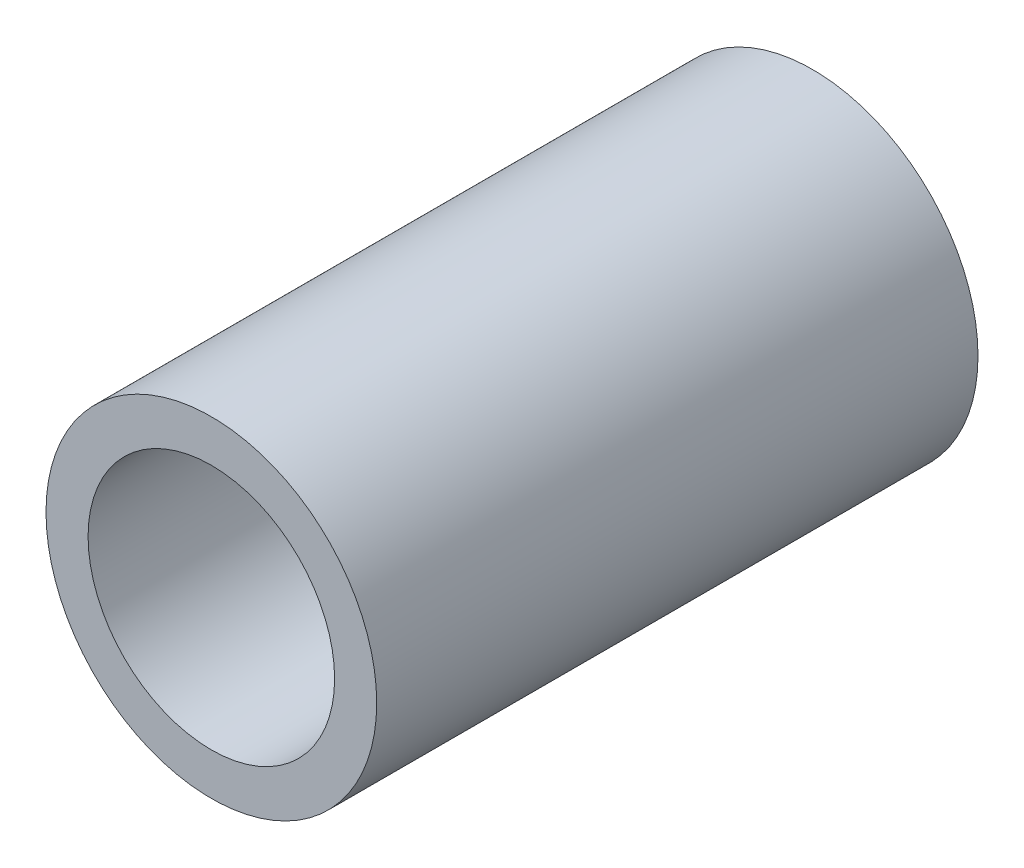
ISO-10303-21;
HEADER;
FILE_DESCRIPTION(('STEP AP214'),'2;1');
FILE_NAME('part.step','',(''),(''),'','','');
FILE_SCHEMA(('AUTOMOTIVE_DESIGN { 1 0 10303 214 1 1 1 1 }'));
ENDSEC;
DATA;
#1=APPLICATION_CONTEXT('core data for automotive mechanical design processes');
#2=APPLICATION_PROTOCOL_DEFINITION('international standard','automotive_design',2000,#1);
#3=PRODUCT_CONTEXT('',#1,'mechanical');
#4=PRODUCT('Part','Part','',(#3));
#5=PRODUCT_RELATED_PRODUCT_CATEGORY('part','',(#4));
#6=PRODUCT_DEFINITION_FORMATION('','',#4);
#7=PRODUCT_DEFINITION_CONTEXT('part definition',#1,'design');
#8=PRODUCT_DEFINITION('design','',#6,#7);
#9=PRODUCT_DEFINITION_SHAPE('','',#8);
#10=(LENGTH_UNIT() NAMED_UNIT(*) SI_UNIT(.MILLI.,.METRE.));
#11=(NAMED_UNIT(*) PLANE_ANGLE_UNIT() SI_UNIT($,.RADIAN.));
#12=(NAMED_UNIT(*) SI_UNIT($,.STERADIAN.) SOLID_ANGLE_UNIT());
#13=UNCERTAINTY_MEASURE_WITH_UNIT(LENGTH_MEASURE(1.E-05),#10,'distance_accuracy_value','');
#14=(GEOMETRIC_REPRESENTATION_CONTEXT(3) GLOBAL_UNCERTAINTY_ASSIGNED_CONTEXT((#13)) GLOBAL_UNIT_ASSIGNED_CONTEXT((#10,
#11,#12)) REPRESENTATION_CONTEXT('',''));
#15=CARTESIAN_POINT('',(0.,0.,0.));
#16=DIRECTION('',(0.,0.,1.));
#17=DIRECTION('',(1.,0.,0.));
#18=AXIS2_PLACEMENT_3D('',#15,#16,#17);
#19=CARTESIAN_POINT('',(0.,0.,15.));
#20=DIRECTION('',(0.,0.,1.));
#21=DIRECTION('',(1.,0.,0.));
#22=AXIS2_PLACEMENT_3D('',#19,#20,#21);
#23=PLANE('',#22);
#24=CARTESIAN_POINT('',(0.,0.,15.));
#25=DIRECTION('',(0.,0.,1.));
#26=DIRECTION('',(1.,0.,0.));
#27=AXIS2_PLACEMENT_3D('',#24,#25,#26);
#28=CIRCLE('',#27,4.125);
#29=CARTESIAN_POINT('',(4.125,0.,15.));
#30=VERTEX_POINT('',#29);
#31=EDGE_CURVE('E10',#30,#30,#28,.T.);
#32=ORIENTED_EDGE('',*,*,#31,.T.);
#33=EDGE_LOOP('',(#32));
#34=FACE_BOUND('',#33,.T.);
#35=CARTESIAN_POINT('',(0.,0.,15.));
#36=DIRECTION('',(0.,0.,1.));
#37=DIRECTION('',(1.,0.,0.));
#38=AXIS2_PLACEMENT_3D('',#35,#36,#37);
#39=CIRCLE('',#38,3.075);
#40=CARTESIAN_POINT('',(3.075,0.,15.));
#41=VERTEX_POINT('',#40);
#42=EDGE_CURVE('E46',#41,#41,#39,.T.);
#43=ORIENTED_EDGE('',*,*,#42,.F.);
#44=EDGE_LOOP('',(#43));
#45=FACE_BOUND('',#44,.T.);
#46=ADVANCED_FACE('F35',(#34,#45),#23,.T.);
#47=CARTESIAN_POINT('',(0.,0.,0.));
#48=DIRECTION('',(0.,0.,1.));
#49=DIRECTION('',(1.,0.,0.));
#50=AXIS2_PLACEMENT_3D('',#47,#48,#49);
#51=PLANE('',#50);
#52=CARTESIAN_POINT('',(0.,0.,0.));
#53=DIRECTION('',(0.,0.,1.));
#54=DIRECTION('',(1.,0.,0.));
#55=AXIS2_PLACEMENT_3D('',#52,#53,#54);
#56=CIRCLE('',#55,4.125);
#57=CARTESIAN_POINT('',(4.125,0.,0.));
#58=VERTEX_POINT('',#57);
#59=EDGE_CURVE('E39',#58,#58,#56,.T.);
#60=ORIENTED_EDGE('',*,*,#59,.F.);
#61=EDGE_LOOP('',(#60));
#62=FACE_BOUND('',#61,.T.);
#63=CARTESIAN_POINT('',(0.,0.,0.));
#64=DIRECTION('',(0.,0.,1.));
#65=DIRECTION('',(1.,0.,0.));
#66=AXIS2_PLACEMENT_3D('',#63,#64,#65);
#67=CIRCLE('',#66,3.075);
#68=CARTESIAN_POINT('',(3.075,0.,0.));
#69=VERTEX_POINT('',#68);
#70=EDGE_CURVE('E48',#69,#69,#67,.T.);
#71=ORIENTED_EDGE('',*,*,#70,.T.);
#72=EDGE_LOOP('',(#71));
#73=FACE_BOUND('',#72,.T.);
#74=ADVANCED_FACE('F58',(#62,#73),#51,.F.);
#75=CARTESIAN_POINT('',(0.,0.,15.));
#76=DIRECTION('',(0.,0.,-1.));
#77=DIRECTION('',(-1.,0.,0.));
#78=AXIS2_PLACEMENT_3D('',#75,#76,#77);
#79=CYLINDRICAL_SURFACE('',#78,4.125);
#80=ORIENTED_EDGE('',*,*,#31,.F.);
#81=EDGE_LOOP('',(#80));
#82=FACE_BOUND('',#81,.T.);
#83=ORIENTED_EDGE('',*,*,#59,.T.);
#84=EDGE_LOOP('',(#83));
#85=FACE_BOUND('',#84,.T.);
#86=ADVANCED_FACE('F37',(#82,#85),#79,.T.);
#87=CARTESIAN_POINT('',(0.,0.,15.));
#88=DIRECTION('',(0.,0.,-1.));
#89=DIRECTION('',(-1.,0.,0.));
#90=AXIS2_PLACEMENT_3D('',#87,#88,#89);
#91=CYLINDRICAL_SURFACE('',#90,3.075);
#92=ORIENTED_EDGE('',*,*,#42,.T.);
#93=EDGE_LOOP('',(#92));
#94=FACE_BOUND('',#93,.T.);
#95=ORIENTED_EDGE('',*,*,#70,.F.);
#96=EDGE_LOOP('',(#95));
#97=FACE_BOUND('',#96,.T.);
#98=ADVANCED_FACE('F54',(#94,#97),#91,.F.);
#99=CLOSED_SHELL('',(#46,#74,#86,#98));
#100=MANIFOLD_SOLID_BREP('B2',#99);
#101=ADVANCED_BREP_SHAPE_REPRESENTATION('',(#18,#100),#14);
#102=SHAPE_DEFINITION_REPRESENTATION(#9,#101);
ENDSEC;
END-ISO-10303-21;
